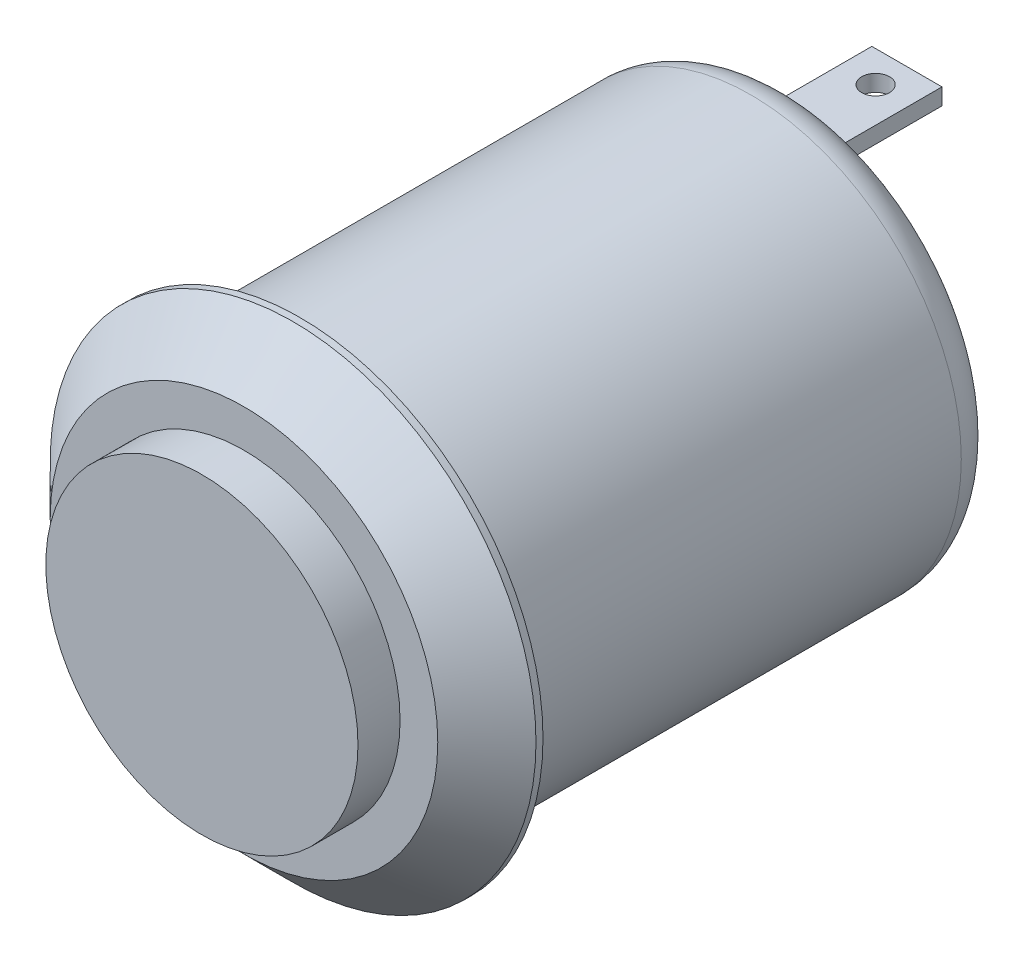
ISO-10303-21;
HEADER;
FILE_DESCRIPTION(('STEP AP214'),'2;1');
FILE_NAME('part.step','',(''),(''),'','','');
FILE_SCHEMA(('AUTOMOTIVE_DESIGN { 1 0 10303 214 1 1 1 1 }'));
ENDSEC;
DATA;
#1=APPLICATION_CONTEXT('core data for automotive mechanical design processes');
#2=APPLICATION_PROTOCOL_DEFINITION('international standard','automotive_design',2000,#1);
#3=PRODUCT_CONTEXT('',#1,'mechanical');
#4=PRODUCT('Part','Part','',(#3));
#5=PRODUCT_RELATED_PRODUCT_CATEGORY('part','',(#4));
#6=PRODUCT_DEFINITION_FORMATION('','',#4);
#7=PRODUCT_DEFINITION_CONTEXT('part definition',#1,'design');
#8=PRODUCT_DEFINITION('design','',#6,#7);
#9=PRODUCT_DEFINITION_SHAPE('','',#8);
#10=(LENGTH_UNIT() NAMED_UNIT(*) SI_UNIT(.MILLI.,.METRE.));
#11=(NAMED_UNIT(*) PLANE_ANGLE_UNIT() SI_UNIT($,.RADIAN.));
#12=(NAMED_UNIT(*) SI_UNIT($,.STERADIAN.) SOLID_ANGLE_UNIT());
#13=UNCERTAINTY_MEASURE_WITH_UNIT(LENGTH_MEASURE(1.E-05),#10,'distance_accuracy_value','');
#14=(GEOMETRIC_REPRESENTATION_CONTEXT(3) GLOBAL_UNCERTAINTY_ASSIGNED_CONTEXT((#13)) GLOBAL_UNIT_ASSIGNED_CONTEXT((#10,
#11,#12)) REPRESENTATION_CONTEXT('',''));
#15=CARTESIAN_POINT('',(0.,0.,0.));
#16=DIRECTION('',(0.,0.,1.));
#17=DIRECTION('',(1.,0.,0.));
#18=AXIS2_PLACEMENT_3D('',#15,#16,#17);
#19=CARTESIAN_POINT('',(0.,0.,-14.));
#20=DIRECTION('',(0.,0.,1.));
#21=DIRECTION('',(1.,0.,0.));
#22=AXIS2_PLACEMENT_3D('',#19,#20,#21);
#23=PLANE('',#22);
#24=DIRECTION('',(0.,1.,0.));
#25=VECTOR('',#24,1.);
#26=CARTESIAN_POINT('',(-1.,4.,-14.));
#27=LINE('',#26,#25);
#28=CARTESIAN_POINT('',(-1.,4.,-14.));
#29=VERTEX_POINT('',#28);
#30=CARTESIAN_POINT('',(-1.,4.47,-14.));
#31=VERTEX_POINT('',#30);
#32=EDGE_CURVE('E123',#29,#31,#27,.T.);
#33=ORIENTED_EDGE('',*,*,#32,.F.);
#34=DIRECTION('',(-1.,0.,0.));
#35=VECTOR('',#34,1.);
#36=CARTESIAN_POINT('',(1.,4.,-14.));
#37=LINE('',#36,#35);
#38=CARTESIAN_POINT('',(1.,4.,-14.));
#39=VERTEX_POINT('',#38);
#40=EDGE_CURVE('E136',#39,#29,#37,.T.);
#41=ORIENTED_EDGE('',*,*,#40,.F.);
#42=DIRECTION('',(0.,-1.,0.));
#43=VECTOR('',#42,1.);
#44=CARTESIAN_POINT('',(1.,4.,-14.));
#45=LINE('',#44,#43);
#46=CARTESIAN_POINT('',(1.,4.47,-14.));
#47=VERTEX_POINT('',#46);
#48=EDGE_CURVE('E145',#47,#39,#45,.T.);
#49=ORIENTED_EDGE('',*,*,#48,.F.);
#50=DIRECTION('',(1.,0.,0.));
#51=VECTOR('',#50,1.);
#52=CARTESIAN_POINT('',(1.,4.47,-14.));
#53=LINE('',#52,#51);
#54=EDGE_CURVE('E126',#31,#47,#53,.T.);
#55=ORIENTED_EDGE('',*,*,#54,.F.);
#56=EDGE_LOOP('',(#33,#41,#49,#55));
#57=FACE_BOUND('',#56,.T.);
#58=CARTESIAN_POINT('',(0.,0.,-14.));
#59=DIRECTION('',(0.,0.,1.));
#60=DIRECTION('',(1.,0.,0.));
#61=AXIS2_PLACEMENT_3D('',#58,#59,#60);
#62=CIRCLE('',#61,4.85);
#63=CARTESIAN_POINT('',(4.85,0.,-14.));
#64=VERTEX_POINT('',#63);
#65=EDGE_CURVE('E11',#64,#64,#62,.F.);
#66=ORIENTED_EDGE('',*,*,#65,.T.);
#67=EDGE_LOOP('',(#66));
#68=FACE_BOUND('',#67,.T.);
#69=DIRECTION('',(0.,-1.,0.));
#70=VECTOR('',#69,1.);
#71=CARTESIAN_POINT('',(1.,-4.,-14.));
#72=LINE('',#71,#70);
#73=CARTESIAN_POINT('',(1.,-4.,-14.));
#74=VERTEX_POINT('',#73);
#75=CARTESIAN_POINT('',(1.,-4.47,-14.));
#76=VERTEX_POINT('',#75);
#77=EDGE_CURVE('E122',#74,#76,#72,.T.);
#78=ORIENTED_EDGE('',*,*,#77,.F.);
#79=DIRECTION('',(1.,0.,0.));
#80=VECTOR('',#79,1.);
#81=CARTESIAN_POINT('',(1.,-4.,-14.));
#82=LINE('',#81,#80);
#83=CARTESIAN_POINT('',(-1.,-4.,-14.));
#84=VERTEX_POINT('',#83);
#85=EDGE_CURVE('E119',#84,#74,#82,.T.);
#86=ORIENTED_EDGE('',*,*,#85,.F.);
#87=DIRECTION('',(0.,1.,0.));
#88=VECTOR('',#87,1.);
#89=CARTESIAN_POINT('',(-1.,-4.,-14.));
#90=LINE('',#89,#88);
#91=CARTESIAN_POINT('',(-1.,-4.47,-14.));
#92=VERTEX_POINT('',#91);
#93=EDGE_CURVE('E57',#92,#84,#90,.T.);
#94=ORIENTED_EDGE('',*,*,#93,.F.);
#95=DIRECTION('',(-1.,0.,0.));
#96=VECTOR('',#95,1.);
#97=CARTESIAN_POINT('',(1.,-4.47,-14.));
#98=LINE('',#97,#96);
#99=EDGE_CURVE('E52',#76,#92,#98,.T.);
#100=ORIENTED_EDGE('',*,*,#99,.F.);
#101=EDGE_LOOP('',(#78,#86,#94,#100));
#102=FACE_BOUND('',#101,.T.);
#103=ADVANCED_FACE('F36',(#57,#68,#102),#23,.F.);
#104=CARTESIAN_POINT('',(0.,0.,-14.));
#105=DIRECTION('',(0.,0.,1.));
#106=DIRECTION('',(1.,0.,0.));
#107=AXIS2_PLACEMENT_3D('',#104,#105,#106);
#108=CYLINDRICAL_SURFACE('',#107,6.);
#109=CARTESIAN_POINT('',(0.,0.,-12.85));
#110=DIRECTION('',(0.,0.,1.));
#111=DIRECTION('',(1.,0.,0.));
#112=AXIS2_PLACEMENT_3D('',#109,#110,#111);
#113=CIRCLE('',#112,6.);
#114=CARTESIAN_POINT('',(6.,0.,-12.85));
#115=VERTEX_POINT('',#114);
#116=EDGE_CURVE('E45',#115,#115,#113,.T.);
#117=ORIENTED_EDGE('',*,*,#116,.T.);
#118=EDGE_LOOP('',(#117));
#119=FACE_BOUND('',#118,.T.);
#120=CARTESIAN_POINT('',(0.,0.,0.));
#121=DIRECTION('',(0.,0.,1.));
#122=DIRECTION('',(1.,0.,0.));
#123=AXIS2_PLACEMENT_3D('',#120,#121,#122);
#124=CIRCLE('',#123,6.);
#125=CARTESIAN_POINT('',(6.,0.,0.));
#126=VERTEX_POINT('',#125);
#127=EDGE_CURVE('E171',#126,#126,#124,.T.);
#128=ORIENTED_EDGE('',*,*,#127,.F.);
#129=EDGE_LOOP('',(#128));
#130=FACE_BOUND('',#129,.T.);
#131=ADVANCED_FACE('F182',(#119,#130),#108,.T.);
#132=CARTESIAN_POINT('',(0.,0.,1.6));
#133=DIRECTION('',(0.,0.,-1.));
#134=DIRECTION('',(-1.,0.,0.));
#135=AXIS2_PLACEMENT_3D('',#132,#133,#134);
#136=CYLINDRICAL_SURFACE('',#135,6.925);
#137=CARTESIAN_POINT('',(0.,0.,0.199999999999992));
#138=DIRECTION('',(0.,0.,1.));
#139=DIRECTION('',(1.,0.,0.));
#140=AXIS2_PLACEMENT_3D('',#137,#138,#139);
#141=CIRCLE('',#140,6.925);
#142=CARTESIAN_POINT('',(6.925,0.,0.199999999999992));
#143=VERTEX_POINT('',#142);
#144=EDGE_CURVE('E168',#143,#143,#141,.F.);
#145=ORIENTED_EDGE('',*,*,#144,.T.);
#146=EDGE_LOOP('',(#145));
#147=FACE_BOUND('',#146,.T.);
#148=CARTESIAN_POINT('',(0.,0.,0.));
#149=DIRECTION('',(0.,0.,1.));
#150=DIRECTION('',(1.,0.,0.));
#151=AXIS2_PLACEMENT_3D('',#148,#149,#150);
#152=CIRCLE('',#151,6.925);
#153=CARTESIAN_POINT('',(6.925,0.,0.));
#154=VERTEX_POINT('',#153);
#155=EDGE_CURVE('E164',#154,#154,#152,.T.);
#156=ORIENTED_EDGE('',*,*,#155,.T.);
#157=EDGE_LOOP('',(#156));
#158=FACE_BOUND('',#157,.T.);
#159=ADVANCED_FACE('F206',(#147,#158),#136,.T.);
#160=CARTESIAN_POINT('',(0.,0.,1.6));
#161=DIRECTION('',(0.,0.,1.));
#162=DIRECTION('',(1.,0.,0.));
#163=AXIS2_PLACEMENT_3D('',#160,#161,#162);
#164=PLANE('',#163);
#165=CARTESIAN_POINT('',(0.,0.,1.6));
#166=DIRECTION('',(0.,0.,1.));
#167=DIRECTION('',(1.,0.,0.));
#168=AXIS2_PLACEMENT_3D('',#165,#166,#167);
#169=CIRCLE('',#168,4.45);
#170=CARTESIAN_POINT('',(4.45,0.,1.6));
#171=VERTEX_POINT('',#170);
#172=EDGE_CURVE('E165',#171,#171,#169,.T.);
#173=ORIENTED_EDGE('',*,*,#172,.F.);
#174=EDGE_LOOP('',(#173));
#175=FACE_BOUND('',#174,.T.);
#176=CARTESIAN_POINT('',(0.,0.,1.6));
#177=DIRECTION('',(0.,0.,1.));
#178=DIRECTION('',(1.,0.,0.));
#179=AXIS2_PLACEMENT_3D('',#176,#177,#178);
#180=CIRCLE('',#179,5.52499999999999);
#181=CARTESIAN_POINT('',(5.52499999999999,0.,1.6));
#182=VERTEX_POINT('',#181);
#183=EDGE_CURVE('E174',#182,#182,#180,.T.);
#184=ORIENTED_EDGE('',*,*,#183,.T.);
#185=EDGE_LOOP('',(#184));
#186=FACE_BOUND('',#185,.T.);
#187=ADVANCED_FACE('F224',(#175,#186),#164,.T.);
#188=CARTESIAN_POINT('',(0.,0.,0.));
#189=DIRECTION('',(0.,0.,1.));
#190=DIRECTION('',(1.,0.,0.));
#191=AXIS2_PLACEMENT_3D('',#188,#189,#190);
#192=PLANE('',#191);
#193=ORIENTED_EDGE('',*,*,#127,.T.);
#194=EDGE_LOOP('',(#193));
#195=FACE_BOUND('',#194,.T.);
#196=ORIENTED_EDGE('',*,*,#155,.F.);
#197=EDGE_LOOP('',(#196));
#198=FACE_BOUND('',#197,.T.);
#199=ADVANCED_FACE('F216',(#195,#198),#192,.F.);
#200=CARTESIAN_POINT('',(0.,0.,1.6));
#201=DIRECTION('',(0.,0.,-1.));
#202=DIRECTION('',(-1.,0.,0.));
#203=AXIS2_PLACEMENT_3D('',#200,#201,#202);
#204=CONICAL_SURFACE('',#203,5.52499999999999,0.785398163397448);
#205=ORIENTED_EDGE('',*,*,#144,.F.);
#206=EDGE_LOOP('',(#205));
#207=FACE_BOUND('',#206,.T.);
#208=ORIENTED_EDGE('',*,*,#183,.F.);
#209=EDGE_LOOP('',(#208));
#210=FACE_BOUND('',#209,.T.);
#211=ADVANCED_FACE('F212',(#207,#210),#204,.T.);
#212=CARTESIAN_POINT('',(0.,0.,2.8));
#213=DIRECTION('',(0.,0.,-1.));
#214=DIRECTION('',(-1.,0.,0.));
#215=AXIS2_PLACEMENT_3D('',#212,#213,#214);
#216=CYLINDRICAL_SURFACE('',#215,4.45);
#217=CARTESIAN_POINT('',(0.,0.,2.8));
#218=DIRECTION('',(0.,0.,1.));
#219=DIRECTION('',(1.,0.,0.));
#220=AXIS2_PLACEMENT_3D('',#217,#218,#219);
#221=CIRCLE('',#220,4.45);
#222=CARTESIAN_POINT('',(4.45,0.,2.8));
#223=VERTEX_POINT('',#222);
#224=EDGE_CURVE('E161',#223,#223,#221,.T.);
#225=ORIENTED_EDGE('',*,*,#224,.F.);
#226=EDGE_LOOP('',(#225));
#227=FACE_BOUND('',#226,.T.);
#228=ORIENTED_EDGE('',*,*,#172,.T.);
#229=EDGE_LOOP('',(#228));
#230=FACE_BOUND('',#229,.T.);
#231=ADVANCED_FACE('F196',(#227,#230),#216,.T.);
#232=CARTESIAN_POINT('',(0.,0.,2.8));
#233=DIRECTION('',(0.,0.,1.));
#234=DIRECTION('',(1.,0.,0.));
#235=AXIS2_PLACEMENT_3D('',#232,#233,#234);
#236=PLANE('',#235);
#237=ORIENTED_EDGE('',*,*,#224,.T.);
#238=EDGE_LOOP('',(#237));
#239=FACE_BOUND('',#238,.T.);
#240=ADVANCED_FACE('F187',(#239),#236,.T.);
#241=CARTESIAN_POINT('',(0.,0.,-12.85));
#242=DIRECTION('',(0.,0.,1.));
#243=DIRECTION('',(1.,0.,0.));
#244=AXIS2_PLACEMENT_3D('',#241,#242,#243);
#245=TOROIDAL_SURFACE('',#244,4.85,1.15);
#246=ORIENTED_EDGE('',*,*,#65,.F.);
#247=EDGE_LOOP('',(#246));
#248=FACE_BOUND('',#247,.T.);
#249=ORIENTED_EDGE('',*,*,#116,.F.);
#250=EDGE_LOOP('',(#249));
#251=FACE_BOUND('',#250,.T.);
#252=ADVANCED_FACE('F38',(#248,#251),#245,.T.);
#253=CARTESIAN_POINT('',(-1.,4.,-17.3));
#254=DIRECTION('',(1.,0.,0.));
#255=DIRECTION('',(0.,0.,-1.));
#256=AXIS2_PLACEMENT_3D('',#253,#254,#255);
#257=PLANE('',#256);
#258=ORIENTED_EDGE('',*,*,#32,.T.);
#259=DIRECTION('',(0.,0.,1.));
#260=VECTOR('',#259,1.);
#261=CARTESIAN_POINT('',(-1.,4.47,-17.3));
#262=LINE('',#261,#260);
#263=CARTESIAN_POINT('',(-1.,4.47,-17.3));
#264=VERTEX_POINT('',#263);
#265=EDGE_CURVE('E158',#264,#31,#262,.T.);
#266=ORIENTED_EDGE('',*,*,#265,.F.);
#267=DIRECTION('',(0.,1.,0.));
#268=VECTOR('',#267,1.);
#269=CARTESIAN_POINT('',(-1.,4.,-17.3));
#270=LINE('',#269,#268);
#271=CARTESIAN_POINT('',(-1.,4.,-17.3));
#272=VERTEX_POINT('',#271);
#273=EDGE_CURVE('E132',#272,#264,#270,.T.);
#274=ORIENTED_EDGE('',*,*,#273,.F.);
#275=DIRECTION('',(0.,0.,1.));
#276=VECTOR('',#275,1.);
#277=CARTESIAN_POINT('',(-1.,4.,-17.3));
#278=LINE('',#277,#276);
#279=EDGE_CURVE('E141',#272,#29,#278,.T.);
#280=ORIENTED_EDGE('',*,*,#279,.T.);
#281=EDGE_LOOP('',(#258,#266,#274,#280));
#282=FACE_BOUND('',#281,.T.);
#283=ADVANCED_FACE('F186',(#282),#257,.F.);
#284=CARTESIAN_POINT('',(1.,4.47,-17.3));
#285=DIRECTION('',(0.,-1.,0.));
#286=DIRECTION('',(0.,0.,-1.));
#287=AXIS2_PLACEMENT_3D('',#284,#285,#286);
#288=PLANE('',#287);
#289=CARTESIAN_POINT('',(0.,4.47,-16.4080050754331));
#290=DIRECTION('',(0.,1.,0.));
#291=DIRECTION('',(0.,0.,1.));
#292=AXIS2_PLACEMENT_3D('',#289,#290,#291);
#293=CIRCLE('',#292,0.395429062144714);
#294=CARTESIAN_POINT('',(0.,4.47,-16.0125760132884));
#295=VERTEX_POINT('',#294);
#296=EDGE_CURVE('E280',#295,#295,#293,.T.);
#297=ORIENTED_EDGE('',*,*,#296,.F.);
#298=EDGE_LOOP('',(#297));
#299=FACE_BOUND('',#298,.T.);
#300=ORIENTED_EDGE('',*,*,#54,.T.);
#301=DIRECTION('',(0.,0.,1.));
#302=VECTOR('',#301,1.);
#303=CARTESIAN_POINT('',(1.,4.47,-17.3));
#304=LINE('',#303,#302);
#305=CARTESIAN_POINT('',(1.,4.47,-17.3));
#306=VERTEX_POINT('',#305);
#307=EDGE_CURVE('E155',#306,#47,#304,.T.);
#308=ORIENTED_EDGE('',*,*,#307,.F.);
#309=DIRECTION('',(1.,0.,0.));
#310=VECTOR('',#309,1.);
#311=CARTESIAN_POINT('',(1.,4.47,-17.3));
#312=LINE('',#311,#310);
#313=EDGE_CURVE('E135',#264,#306,#312,.T.);
#314=ORIENTED_EDGE('',*,*,#313,.F.);
#315=ORIENTED_EDGE('',*,*,#265,.T.);
#316=EDGE_LOOP('',(#300,#308,#314,#315));
#317=FACE_BOUND('',#316,.T.);
#318=ADVANCED_FACE('F193',(#299,#317),#288,.F.);
#319=CARTESIAN_POINT('',(1.,4.,-17.3));
#320=DIRECTION('',(-1.,0.,0.));
#321=DIRECTION('',(0.,0.,1.));
#322=AXIS2_PLACEMENT_3D('',#319,#320,#321);
#323=PLANE('',#322);
#324=ORIENTED_EDGE('',*,*,#48,.T.);
#325=DIRECTION('',(0.,0.,1.));
#326=VECTOR('',#325,1.);
#327=CARTESIAN_POINT('',(1.,4.,-17.3));
#328=LINE('',#327,#326);
#329=CARTESIAN_POINT('',(1.,4.,-17.3));
#330=VERTEX_POINT('',#329);
#331=EDGE_CURVE('E152',#330,#39,#328,.T.);
#332=ORIENTED_EDGE('',*,*,#331,.F.);
#333=DIRECTION('',(0.,-1.,0.));
#334=VECTOR('',#333,1.);
#335=CARTESIAN_POINT('',(1.,4.,-17.3));
#336=LINE('',#335,#334);
#337=EDGE_CURVE('E138',#306,#330,#336,.T.);
#338=ORIENTED_EDGE('',*,*,#337,.F.);
#339=ORIENTED_EDGE('',*,*,#307,.T.);
#340=EDGE_LOOP('',(#324,#332,#338,#339));
#341=FACE_BOUND('',#340,.T.);
#342=ADVANCED_FACE('F241',(#341),#323,.F.);
#343=CARTESIAN_POINT('',(1.,4.,-17.3));
#344=DIRECTION('',(0.,1.,0.));
#345=DIRECTION('',(0.,0.,1.));
#346=AXIS2_PLACEMENT_3D('',#343,#344,#345);
#347=PLANE('',#346);
#348=CARTESIAN_POINT('',(0.,4.,-16.4080050754331));
#349=DIRECTION('',(0.,1.,0.));
#350=DIRECTION('',(0.,0.,1.));
#351=AXIS2_PLACEMENT_3D('',#348,#349,#350);
#352=CIRCLE('',#351,0.395429062144714);
#353=CARTESIAN_POINT('',(0.,4.,-16.0125760132884));
#354=VERTEX_POINT('',#353);
#355=EDGE_CURVE('E283',#354,#354,#352,.T.);
#356=ORIENTED_EDGE('',*,*,#355,.T.);
#357=EDGE_LOOP('',(#356));
#358=FACE_BOUND('',#357,.T.);
#359=ORIENTED_EDGE('',*,*,#40,.T.);
#360=ORIENTED_EDGE('',*,*,#279,.F.);
#361=DIRECTION('',(-1.,0.,0.));
#362=VECTOR('',#361,1.);
#363=CARTESIAN_POINT('',(1.,4.,-17.3));
#364=LINE('',#363,#362);
#365=EDGE_CURVE('E140',#330,#272,#364,.T.);
#366=ORIENTED_EDGE('',*,*,#365,.F.);
#367=ORIENTED_EDGE('',*,*,#331,.T.);
#368=EDGE_LOOP('',(#359,#360,#366,#367));
#369=FACE_BOUND('',#368,.T.);
#370=ADVANCED_FACE('F245',(#358,#369),#347,.F.);
#371=CARTESIAN_POINT('',(0.,0.,-17.3));
#372=DIRECTION('',(0.,0.,1.));
#373=DIRECTION('',(1.,0.,0.));
#374=AXIS2_PLACEMENT_3D('',#371,#372,#373);
#375=PLANE('',#374);
#376=ORIENTED_EDGE('',*,*,#273,.T.);
#377=ORIENTED_EDGE('',*,*,#313,.T.);
#378=ORIENTED_EDGE('',*,*,#337,.T.);
#379=ORIENTED_EDGE('',*,*,#365,.T.);
#380=EDGE_LOOP('',(#376,#377,#378,#379));
#381=FACE_BOUND('',#380,.T.);
#382=ADVANCED_FACE('F249',(#381),#375,.F.);
#383=CARTESIAN_POINT('',(1.,-4.,-17.3));
#384=DIRECTION('',(-1.,0.,0.));
#385=DIRECTION('',(0.,0.,1.));
#386=AXIS2_PLACEMENT_3D('',#383,#384,#385);
#387=PLANE('',#386);
#388=ORIENTED_EDGE('',*,*,#77,.T.);
#389=DIRECTION('',(0.,0.,1.));
#390=VECTOR('',#389,1.);
#391=CARTESIAN_POINT('',(1.,-4.47,-17.3));
#392=LINE('',#391,#390);
#393=CARTESIAN_POINT('',(1.,-4.47,-17.3));
#394=VERTEX_POINT('',#393);
#395=EDGE_CURVE('E103',#394,#76,#392,.T.);
#396=ORIENTED_EDGE('',*,*,#395,.F.);
#397=DIRECTION('',(0.,-1.,0.));
#398=VECTOR('',#397,1.);
#399=CARTESIAN_POINT('',(1.,-4.,-17.3));
#400=LINE('',#399,#398);
#401=CARTESIAN_POINT('',(1.,-4.,-17.3));
#402=VERTEX_POINT('',#401);
#403=EDGE_CURVE('E110',#402,#394,#400,.T.);
#404=ORIENTED_EDGE('',*,*,#403,.F.);
#405=DIRECTION('',(0.,0.,1.));
#406=VECTOR('',#405,1.);
#407=CARTESIAN_POINT('',(1.,-4.,-17.3));
#408=LINE('',#407,#406);
#409=EDGE_CURVE('E292',#402,#74,#408,.T.);
#410=ORIENTED_EDGE('',*,*,#409,.T.);
#411=EDGE_LOOP('',(#388,#396,#404,#410));
#412=FACE_BOUND('',#411,.T.);
#413=ADVANCED_FACE('F121',(#412),#387,.F.);
#414=CARTESIAN_POINT('',(1.,-4.47,-17.3));
#415=DIRECTION('',(0.,1.,0.));
#416=DIRECTION('',(0.,0.,1.));
#417=AXIS2_PLACEMENT_3D('',#414,#415,#416);
#418=PLANE('',#417);
#419=CARTESIAN_POINT('',(0.,-4.47,-16.4080050754331));
#420=DIRECTION('',(0.,1.,0.));
#421=DIRECTION('',(0.,0.,1.));
#422=AXIS2_PLACEMENT_3D('',#419,#420,#421);
#423=CIRCLE('',#422,0.395429062144714);
#424=CARTESIAN_POINT('',(0.,-4.47,-16.0125760132884));
#425=VERTEX_POINT('',#424);
#426=EDGE_CURVE('E284',#425,#425,#423,.T.);
#427=ORIENTED_EDGE('',*,*,#426,.T.);
#428=EDGE_LOOP('',(#427));
#429=FACE_BOUND('',#428,.T.);
#430=ORIENTED_EDGE('',*,*,#99,.T.);
#431=DIRECTION('',(0.,0.,1.));
#432=VECTOR('',#431,1.);
#433=CARTESIAN_POINT('',(-1.,-4.47,-17.3));
#434=LINE('',#433,#432);
#435=CARTESIAN_POINT('',(-1.,-4.47,-17.3));
#436=VERTEX_POINT('',#435);
#437=EDGE_CURVE('E106',#436,#92,#434,.T.);
#438=ORIENTED_EDGE('',*,*,#437,.F.);
#439=DIRECTION('',(-1.,0.,0.));
#440=VECTOR('',#439,1.);
#441=CARTESIAN_POINT('',(1.,-4.47,-17.3));
#442=LINE('',#441,#440);
#443=EDGE_CURVE('E99',#394,#436,#442,.T.);
#444=ORIENTED_EDGE('',*,*,#443,.F.);
#445=ORIENTED_EDGE('',*,*,#395,.T.);
#446=EDGE_LOOP('',(#430,#438,#444,#445));
#447=FACE_BOUND('',#446,.T.);
#448=ADVANCED_FACE('F101',(#429,#447),#418,.F.);
#449=CARTESIAN_POINT('',(-1.,-4.,-17.3));
#450=DIRECTION('',(1.,0.,0.));
#451=DIRECTION('',(0.,0.,-1.));
#452=AXIS2_PLACEMENT_3D('',#449,#450,#451);
#453=PLANE('',#452);
#454=ORIENTED_EDGE('',*,*,#93,.T.);
#455=DIRECTION('',(0.,0.,1.));
#456=VECTOR('',#455,1.);
#457=CARTESIAN_POINT('',(-1.,-4.,-17.3));
#458=LINE('',#457,#456);
#459=CARTESIAN_POINT('',(-1.,-4.,-17.3));
#460=VERTEX_POINT('',#459);
#461=EDGE_CURVE('E128',#460,#84,#458,.T.);
#462=ORIENTED_EDGE('',*,*,#461,.F.);
#463=DIRECTION('',(0.,1.,0.));
#464=VECTOR('',#463,1.);
#465=CARTESIAN_POINT('',(-1.,-4.,-17.3));
#466=LINE('',#465,#464);
#467=EDGE_CURVE('E109',#436,#460,#466,.T.);
#468=ORIENTED_EDGE('',*,*,#467,.F.);
#469=ORIENTED_EDGE('',*,*,#437,.T.);
#470=EDGE_LOOP('',(#454,#462,#468,#469));
#471=FACE_BOUND('',#470,.T.);
#472=ADVANCED_FACE('F258',(#471),#453,.F.);
#473=CARTESIAN_POINT('',(1.,-4.,-17.3));
#474=DIRECTION('',(0.,-1.,0.));
#475=DIRECTION('',(0.,0.,-1.));
#476=AXIS2_PLACEMENT_3D('',#473,#474,#475);
#477=PLANE('',#476);
#478=CARTESIAN_POINT('',(0.,-4.,-16.4080050754331));
#479=DIRECTION('',(0.,-1.,0.));
#480=DIRECTION('',(0.,0.,-1.));
#481=AXIS2_PLACEMENT_3D('',#478,#479,#480);
#482=CIRCLE('',#481,0.395429062144714);
#483=CARTESIAN_POINT('',(0.,-4.,-16.8034341375778));
#484=VERTEX_POINT('',#483);
#485=EDGE_CURVE('E40',#484,#484,#482,.T.);
#486=ORIENTED_EDGE('',*,*,#485,.T.);
#487=EDGE_LOOP('',(#486));
#488=FACE_BOUND('',#487,.T.);
#489=ORIENTED_EDGE('',*,*,#85,.T.);
#490=ORIENTED_EDGE('',*,*,#409,.F.);
#491=DIRECTION('',(1.,0.,0.));
#492=VECTOR('',#491,1.);
#493=CARTESIAN_POINT('',(1.,-4.,-17.3));
#494=LINE('',#493,#492);
#495=EDGE_CURVE('E115',#460,#402,#494,.T.);
#496=ORIENTED_EDGE('',*,*,#495,.F.);
#497=ORIENTED_EDGE('',*,*,#461,.T.);
#498=EDGE_LOOP('',(#489,#490,#496,#497));
#499=FACE_BOUND('',#498,.T.);
#500=ADVANCED_FACE('F262',(#488,#499),#477,.F.);
#501=CARTESIAN_POINT('',(0.,0.,-17.3));
#502=DIRECTION('',(0.,0.,-1.));
#503=DIRECTION('',(-1.,0.,0.));
#504=AXIS2_PLACEMENT_3D('',#501,#502,#503);
#505=PLANE('',#504);
#506=ORIENTED_EDGE('',*,*,#403,.T.);
#507=ORIENTED_EDGE('',*,*,#443,.T.);
#508=ORIENTED_EDGE('',*,*,#467,.T.);
#509=ORIENTED_EDGE('',*,*,#495,.T.);
#510=EDGE_LOOP('',(#506,#507,#508,#509));
#511=FACE_BOUND('',#510,.T.);
#512=ADVANCED_FACE('F113',(#511),#505,.T.);
#513=CARTESIAN_POINT('',(0.,-6.925,-16.4080050754331));
#514=DIRECTION('',(0.,1.,0.));
#515=DIRECTION('',(0.,0.,1.));
#516=AXIS2_PLACEMENT_3D('',#513,#514,#515);
#517=CYLINDRICAL_SURFACE('',#516,0.395429062144714);
#518=ORIENTED_EDGE('',*,*,#485,.F.);
#519=EDGE_LOOP('',(#518));
#520=FACE_BOUND('',#519,.T.);
#521=ORIENTED_EDGE('',*,*,#426,.F.);
#522=EDGE_LOOP('',(#521));
#523=FACE_BOUND('',#522,.T.);
#524=ADVANCED_FACE('F269',(#520,#523),#517,.F.);
#525=ORIENTED_EDGE('',*,*,#296,.T.);
#526=EDGE_LOOP('',(#525));
#527=FACE_BOUND('',#526,.T.);
#528=ORIENTED_EDGE('',*,*,#355,.F.);
#529=EDGE_LOOP('',(#528));
#530=FACE_BOUND('',#529,.T.);
#531=ADVANCED_FACE('F270',(#527,#530),#517,.F.);
#532=CLOSED_SHELL('',(#103,#131,#159,#187,#199,#211,#231,#240,#252,#283,#318,#342,#370,#382,
#413,#448,#472,#500,#512,#524,#531));
#533=MANIFOLD_SOLID_BREP('B2',#532);
#534=ADVANCED_BREP_SHAPE_REPRESENTATION('',(#18,#533),#14);
#535=SHAPE_DEFINITION_REPRESENTATION(#9,#534);
ENDSEC;
END-ISO-10303-21;
